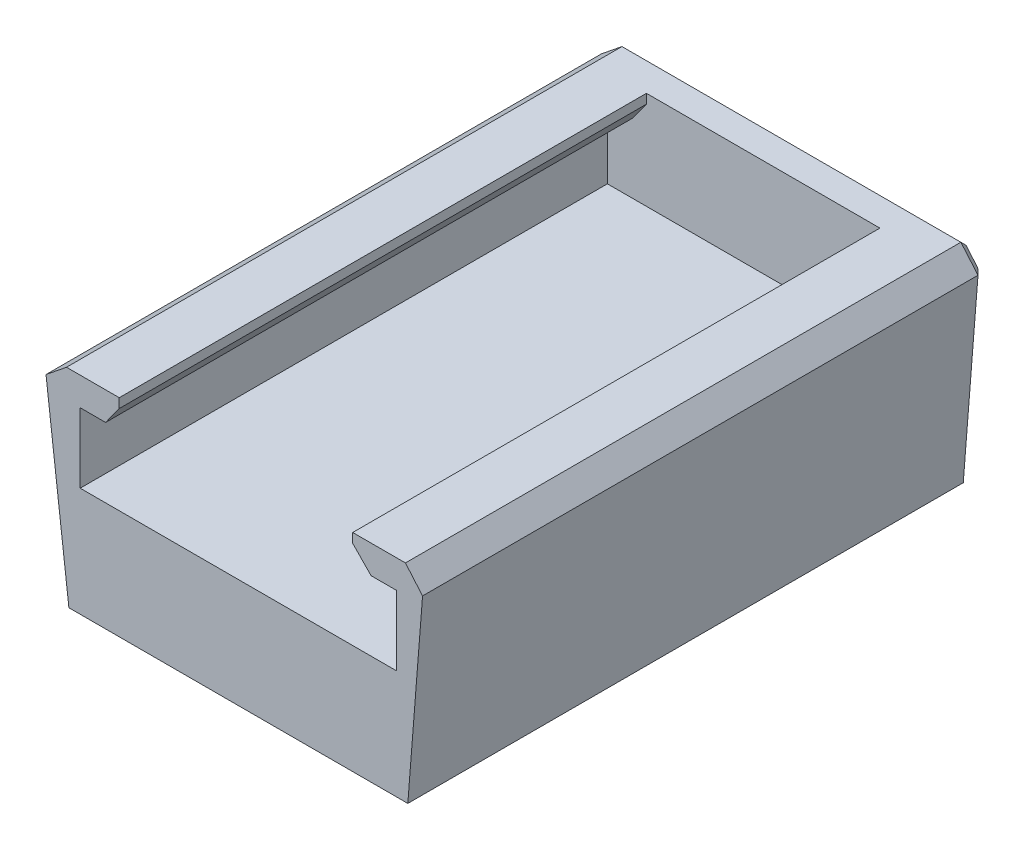
ISO-10303-21;
HEADER;
FILE_DESCRIPTION(('STEP AP214'),'2;1');
FILE_NAME('part.step','',(''),(''),'','','');
FILE_SCHEMA(('AUTOMOTIVE_DESIGN { 1 0 10303 214 1 1 1 1 }'));
ENDSEC;
DATA;
#1=APPLICATION_CONTEXT('core data for automotive mechanical design processes');
#2=APPLICATION_PROTOCOL_DEFINITION('international standard','automotive_design',2000,#1);
#3=PRODUCT_CONTEXT('',#1,'mechanical');
#4=PRODUCT('Part','Part','',(#3));
#5=PRODUCT_RELATED_PRODUCT_CATEGORY('part','',(#4));
#6=PRODUCT_DEFINITION_FORMATION('','',#4);
#7=PRODUCT_DEFINITION_CONTEXT('part definition',#1,'design');
#8=PRODUCT_DEFINITION('design','',#6,#7);
#9=PRODUCT_DEFINITION_SHAPE('','',#8);
#10=(LENGTH_UNIT() NAMED_UNIT(*) SI_UNIT(.MILLI.,.METRE.));
#11=(NAMED_UNIT(*) PLANE_ANGLE_UNIT() SI_UNIT($,.RADIAN.));
#12=(NAMED_UNIT(*) SI_UNIT($,.STERADIAN.) SOLID_ANGLE_UNIT());
#13=UNCERTAINTY_MEASURE_WITH_UNIT(LENGTH_MEASURE(1.E-05),#10,'distance_accuracy_value','');
#14=(GEOMETRIC_REPRESENTATION_CONTEXT(3) GLOBAL_UNCERTAINTY_ASSIGNED_CONTEXT((#13)) GLOBAL_UNIT_ASSIGNED_CONTEXT((#10,
#11,#12)) REPRESENTATION_CONTEXT('',''));
#15=CARTESIAN_POINT('',(0.,0.,0.));
#16=DIRECTION('',(0.,0.,1.));
#17=DIRECTION('',(1.,0.,0.));
#18=AXIS2_PLACEMENT_3D('',#15,#16,#17);
#19=CARTESIAN_POINT('',(-14.4027972027972,9.30053836622378,-30.));
#20=DIRECTION('',(1.,0.,0.));
#21=DIRECTION('',(0.,0.,-1.));
#22=AXIS2_PLACEMENT_3D('',#19,#20,#21);
#23=PLANE('',#22);
#24=DIRECTION('',(0.,0.,1.));
#25=VECTOR('',#24,1.);
#26=CARTESIAN_POINT('',(-14.4027972027972,8.80053836622378,-30.));
#27=LINE('',#26,#25);
#28=CARTESIAN_POINT('',(-14.4027972027972,8.80053836622378,-28.));
#29=VERTEX_POINT('',#28);
#30=CARTESIAN_POINT('',(-14.4027972027972,8.80053836622378,0.));
#31=VERTEX_POINT('',#30);
#32=EDGE_CURVE('E275',#29,#31,#27,.T.);
#33=ORIENTED_EDGE('',*,*,#32,.F.);
#34=DIRECTION('',(0.,1.,0.));
#35=VECTOR('',#34,1.);
#36=CARTESIAN_POINT('',(-14.4027972027972,9.30053836622378,-28.));
#37=LINE('',#36,#35);
#38=CARTESIAN_POINT('',(-14.4027972027972,9.30053836622378,-28.));
#39=VERTEX_POINT('',#38);
#40=EDGE_CURVE('E208',#29,#39,#37,.T.);
#41=ORIENTED_EDGE('',*,*,#40,.T.);
#42=DIRECTION('',(0.,0.,1.));
#43=VECTOR('',#42,1.);
#44=CARTESIAN_POINT('',(-14.4027972027972,9.30053836622378,-30.));
#45=LINE('',#44,#43);
#46=CARTESIAN_POINT('',(-14.4027972027972,9.30053836622378,0.));
#47=VERTEX_POINT('',#46);
#48=EDGE_CURVE('E272',#39,#47,#45,.T.);
#49=ORIENTED_EDGE('',*,*,#48,.T.);
#50=DIRECTION('',(0.,1.,0.));
#51=VECTOR('',#50,1.);
#52=CARTESIAN_POINT('',(-14.4027972027972,9.30053836622378,0.));
#53=LINE('',#52,#51);
#54=EDGE_CURVE('E257',#31,#47,#53,.T.);
#55=ORIENTED_EDGE('',*,*,#54,.F.);
#56=EDGE_LOOP('',(#33,#41,#49,#55));
#57=FACE_BOUND('',#56,.T.);
#58=ADVANCED_FACE('F45',(#57),#23,.T.);
#59=CARTESIAN_POINT('',(-14.4027972027972,8.80053836622378,-30.));
#60=DIRECTION('',(0.810302374787409,-0.586011997670599,0.));
#61=DIRECTION('',(0.586011997670599,0.810302374787409,0.));
#62=AXIS2_PLACEMENT_3D('',#59,#60,#61);
#63=PLANE('',#62);
#64=DIRECTION('',(0.,0.,1.));
#65=VECTOR('',#64,1.);
#66=CARTESIAN_POINT('',(-15.1259988320956,7.80053836622378,-30.));
#67=LINE('',#66,#65);
#68=CARTESIAN_POINT('',(-15.1259988320956,7.80053836622378,-28.));
#69=VERTEX_POINT('',#68);
#70=CARTESIAN_POINT('',(-15.1259988320956,7.80053836622378,0.));
#71=VERTEX_POINT('',#70);
#72=EDGE_CURVE('E278',#69,#71,#67,.T.);
#73=ORIENTED_EDGE('',*,*,#72,.F.);
#74=DIRECTION('',(0.586011997670599,0.810302374787409,0.));
#75=VECTOR('',#74,1.);
#76=CARTESIAN_POINT('',(-14.4027972027972,8.80053836622378,-28.));
#77=LINE('',#76,#75);
#78=EDGE_CURVE('E211',#69,#29,#77,.T.);
#79=ORIENTED_EDGE('',*,*,#78,.T.);
#80=ORIENTED_EDGE('',*,*,#32,.T.);
#81=DIRECTION('',(0.586011997670599,0.810302374787409,0.));
#82=VECTOR('',#81,1.);
#83=CARTESIAN_POINT('',(-14.4027972027972,8.80053836622378,0.));
#84=LINE('',#83,#82);
#85=EDGE_CURVE('E253',#71,#31,#84,.T.);
#86=ORIENTED_EDGE('',*,*,#85,.F.);
#87=EDGE_LOOP('',(#73,#79,#80,#86));
#88=FACE_BOUND('',#87,.T.);
#89=ADVANCED_FACE('F398',(#88),#63,.T.);
#90=CARTESIAN_POINT('',(-16.4759988320956,7.80053836622378,-30.));
#91=DIRECTION('',(0.,-1.,0.));
#92=DIRECTION('',(0.,0.,-1.));
#93=AXIS2_PLACEMENT_3D('',#90,#91,#92);
#94=PLANE('',#93);
#95=DIRECTION('',(0.,0.,1.));
#96=VECTOR('',#95,1.);
#97=CARTESIAN_POINT('',(-16.4759988320956,7.80053836622378,-30.));
#98=LINE('',#97,#96);
#99=CARTESIAN_POINT('',(-16.4759988320956,7.80053836622378,-28.));
#100=VERTEX_POINT('',#99);
#101=CARTESIAN_POINT('',(-16.4759988320956,7.80053836622378,0.));
#102=VERTEX_POINT('',#101);
#103=EDGE_CURVE('E281',#100,#102,#98,.T.);
#104=ORIENTED_EDGE('',*,*,#103,.F.);
#105=DIRECTION('',(1.,0.,0.));
#106=VECTOR('',#105,1.);
#107=CARTESIAN_POINT('',(-16.4759988320956,7.80053836622378,-28.));
#108=LINE('',#107,#106);
#109=EDGE_CURVE('E391',#100,#69,#108,.T.);
#110=ORIENTED_EDGE('',*,*,#109,.T.);
#111=ORIENTED_EDGE('',*,*,#72,.T.);
#112=DIRECTION('',(1.,0.,0.));
#113=VECTOR('',#112,1.);
#114=CARTESIAN_POINT('',(-16.4759988320956,7.80053836622378,0.));
#115=LINE('',#114,#113);
#116=EDGE_CURVE('E249',#102,#71,#115,.T.);
#117=ORIENTED_EDGE('',*,*,#116,.F.);
#118=EDGE_LOOP('',(#104,#110,#111,#117));
#119=FACE_BOUND('',#118,.T.);
#120=ADVANCED_FACE('F437',(#119),#94,.T.);
#121=CARTESIAN_POINT('',(-16.4759988320956,4.10053836622378,-30.));
#122=DIRECTION('',(1.,0.,0.));
#123=DIRECTION('',(0.,0.,-1.));
#124=AXIS2_PLACEMENT_3D('',#121,#122,#123);
#125=PLANE('',#124);
#126=DIRECTION('',(0.,0.,1.));
#127=VECTOR('',#126,1.);
#128=CARTESIAN_POINT('',(-16.4759988320956,4.10053836622378,-30.));
#129=LINE('',#128,#127);
#130=CARTESIAN_POINT('',(-16.4759988320956,4.10053836622378,-28.));
#131=VERTEX_POINT('',#130);
#132=CARTESIAN_POINT('',(-16.4759988320956,4.10053836622378,0.));
#133=VERTEX_POINT('',#132);
#134=EDGE_CURVE('E284',#131,#133,#129,.T.);
#135=ORIENTED_EDGE('',*,*,#134,.F.);
#136=DIRECTION('',(0.,1.,0.));
#137=VECTOR('',#136,1.);
#138=CARTESIAN_POINT('',(-16.4759988320956,4.10053836622378,-28.));
#139=LINE('',#138,#137);
#140=EDGE_CURVE('E379',#131,#100,#139,.T.);
#141=ORIENTED_EDGE('',*,*,#140,.T.);
#142=ORIENTED_EDGE('',*,*,#103,.T.);
#143=DIRECTION('',(0.,1.,0.));
#144=VECTOR('',#143,1.);
#145=CARTESIAN_POINT('',(-16.4759988320956,4.10053836622378,0.));
#146=LINE('',#145,#144);
#147=EDGE_CURVE('E245',#133,#102,#146,.T.);
#148=ORIENTED_EDGE('',*,*,#147,.F.);
#149=EDGE_LOOP('',(#135,#141,#142,#148));
#150=FACE_BOUND('',#149,.T.);
#151=ADVANCED_FACE('F443',(#150),#125,.T.);
#152=CARTESIAN_POINT('',(0.324001167904426,4.10053836622378,-30.));
#153=DIRECTION('',(0.,1.,0.));
#154=DIRECTION('',(0.,0.,1.));
#155=AXIS2_PLACEMENT_3D('',#152,#153,#154);
#156=PLANE('',#155);
#157=DIRECTION('',(0.,0.,1.));
#158=VECTOR('',#157,1.);
#159=CARTESIAN_POINT('',(0.324001167904426,4.10053836622378,-30.));
#160=LINE('',#159,#158);
#161=CARTESIAN_POINT('',(0.324001167904426,4.10053836622378,-28.));
#162=VERTEX_POINT('',#161);
#163=CARTESIAN_POINT('',(0.324001167904426,4.10053836622378,0.));
#164=VERTEX_POINT('',#163);
#165=EDGE_CURVE('E287',#162,#164,#160,.T.);
#166=ORIENTED_EDGE('',*,*,#165,.F.);
#167=DIRECTION('',(-1.,0.,0.));
#168=VECTOR('',#167,1.);
#169=CARTESIAN_POINT('',(0.324001167904426,4.10053836622378,-28.));
#170=LINE('',#169,#168);
#171=EDGE_CURVE('E374',#162,#131,#170,.T.);
#172=ORIENTED_EDGE('',*,*,#171,.T.);
#173=ORIENTED_EDGE('',*,*,#134,.T.);
#174=DIRECTION('',(-1.,0.,0.));
#175=VECTOR('',#174,1.);
#176=CARTESIAN_POINT('',(0.324001167904426,4.10053836622378,0.));
#177=LINE('',#176,#175);
#178=EDGE_CURVE('E241',#164,#133,#177,.T.);
#179=ORIENTED_EDGE('',*,*,#178,.F.);
#180=EDGE_LOOP('',(#166,#172,#173,#179));
#181=FACE_BOUND('',#180,.T.);
#182=ADVANCED_FACE('F447',(#181),#156,.T.);
#183=CARTESIAN_POINT('',(0.324001167904425,7.80053836622378,-30.));
#184=DIRECTION('',(-1.,0.,0.));
#185=DIRECTION('',(0.,-1.,0.));
#186=AXIS2_PLACEMENT_3D('',#183,#184,#185);
#187=PLANE('',#186);
#188=DIRECTION('',(0.,0.,1.));
#189=VECTOR('',#188,1.);
#190=CARTESIAN_POINT('',(0.324001167904425,7.80053836622378,-30.));
#191=LINE('',#190,#189);
#192=CARTESIAN_POINT('',(0.324001167904425,7.80053836622378,-28.));
#193=VERTEX_POINT('',#192);
#194=CARTESIAN_POINT('',(0.324001167904425,7.80053836622378,0.));
#195=VERTEX_POINT('',#194);
#196=EDGE_CURVE('E290',#193,#195,#191,.T.);
#197=ORIENTED_EDGE('',*,*,#196,.F.);
#198=DIRECTION('',(0.,-1.,0.));
#199=VECTOR('',#198,1.);
#200=CARTESIAN_POINT('',(0.324001167904426,4.10053836622378,-28.));
#201=LINE('',#200,#199);
#202=EDGE_CURVE('E369',#193,#162,#201,.T.);
#203=ORIENTED_EDGE('',*,*,#202,.T.);
#204=ORIENTED_EDGE('',*,*,#165,.T.);
#205=DIRECTION('',(0.,-1.,0.));
#206=VECTOR('',#205,1.);
#207=CARTESIAN_POINT('',(0.324001167904425,7.80053836622378,0.));
#208=LINE('',#207,#206);
#209=EDGE_CURVE('E237',#195,#164,#208,.T.);
#210=ORIENTED_EDGE('',*,*,#209,.F.);
#211=EDGE_LOOP('',(#197,#203,#204,#210));
#212=FACE_BOUND('',#211,.T.);
#213=ADVANCED_FACE('F451',(#212),#187,.T.);
#214=CARTESIAN_POINT('',(0.324001167904425,7.80053836622378,-30.));
#215=DIRECTION('',(0.,-1.,0.));
#216=DIRECTION('',(0.,0.,-1.));
#217=AXIS2_PLACEMENT_3D('',#214,#215,#216);
#218=PLANE('',#217);
#219=DIRECTION('',(0.,0.,1.));
#220=VECTOR('',#219,1.);
#221=CARTESIAN_POINT('',(-1.02599883209557,7.80053836622378,-30.));
#222=LINE('',#221,#220);
#223=CARTESIAN_POINT('',(-1.02599883209557,7.80053836622378,-28.));
#224=VERTEX_POINT('',#223);
#225=CARTESIAN_POINT('',(-1.02599883209557,7.80053836622378,0.));
#226=VERTEX_POINT('',#225);
#227=EDGE_CURVE('E293',#224,#226,#222,.T.);
#228=ORIENTED_EDGE('',*,*,#227,.F.);
#229=DIRECTION('',(1.,0.,0.));
#230=VECTOR('',#229,1.);
#231=CARTESIAN_POINT('',(0.324001167904425,7.80053836622378,-28.));
#232=LINE('',#231,#230);
#233=EDGE_CURVE('E388',#224,#193,#232,.T.);
#234=ORIENTED_EDGE('',*,*,#233,.T.);
#235=ORIENTED_EDGE('',*,*,#196,.T.);
#236=DIRECTION('',(1.,0.,0.));
#237=VECTOR('',#236,1.);
#238=CARTESIAN_POINT('',(0.324001167904425,7.80053836622378,0.));
#239=LINE('',#238,#237);
#240=EDGE_CURVE('E233',#226,#195,#239,.T.);
#241=ORIENTED_EDGE('',*,*,#240,.F.);
#242=EDGE_LOOP('',(#228,#234,#235,#241));
#243=FACE_BOUND('',#242,.T.);
#244=ADVANCED_FACE('F453',(#243),#218,.T.);
#245=CARTESIAN_POINT('',(-1.02599883209557,7.80053836622378,-30.));
#246=DIRECTION('',(-0.715356803613816,-0.698759360240294,0.));
#247=DIRECTION('',(0.698759360240294,-0.715356803613816,0.));
#248=AXIS2_PLACEMENT_3D('',#245,#246,#247);
#249=PLANE('',#248);
#250=DIRECTION('',(0.,0.,1.));
#251=VECTOR('',#250,1.);
#252=CARTESIAN_POINT('',(-2.00279720279719,8.80053836622378,-30.));
#253=LINE('',#252,#251);
#254=CARTESIAN_POINT('',(-2.00279720279719,8.80053836622378,-28.));
#255=VERTEX_POINT('',#254);
#256=CARTESIAN_POINT('',(-2.00279720279719,8.80053836622378,0.));
#257=VERTEX_POINT('',#256);
#258=EDGE_CURVE('E296',#255,#257,#253,.T.);
#259=ORIENTED_EDGE('',*,*,#258,.F.);
#260=DIRECTION('',(0.698759360240294,-0.715356803613816,0.));
#261=VECTOR('',#260,1.);
#262=CARTESIAN_POINT('',(-1.02599883209557,7.80053836622378,-28.));
#263=LINE('',#262,#261);
#264=EDGE_CURVE('E385',#255,#224,#263,.T.);
#265=ORIENTED_EDGE('',*,*,#264,.T.);
#266=ORIENTED_EDGE('',*,*,#227,.T.);
#267=DIRECTION('',(0.698759360240294,-0.715356803613816,0.));
#268=VECTOR('',#267,1.);
#269=CARTESIAN_POINT('',(-1.02599883209557,7.80053836622378,0.));
#270=LINE('',#269,#268);
#271=EDGE_CURVE('E229',#257,#226,#270,.T.);
#272=ORIENTED_EDGE('',*,*,#271,.F.);
#273=EDGE_LOOP('',(#259,#265,#266,#272));
#274=FACE_BOUND('',#273,.T.);
#275=ADVANCED_FACE('F415',(#274),#249,.T.);
#276=CARTESIAN_POINT('',(-2.00279720279719,9.30053836622378,-30.));
#277=DIRECTION('',(-1.,0.,0.));
#278=DIRECTION('',(0.,0.,1.));
#279=AXIS2_PLACEMENT_3D('',#276,#277,#278);
#280=PLANE('',#279);
#281=DIRECTION('',(0.,0.,1.));
#282=VECTOR('',#281,1.);
#283=CARTESIAN_POINT('',(-2.00279720279719,9.30053836622378,-30.));
#284=LINE('',#283,#282);
#285=CARTESIAN_POINT('',(-2.00279720279719,9.30053836622378,-28.));
#286=VERTEX_POINT('',#285);
#287=CARTESIAN_POINT('',(-2.00279720279719,9.30053836622378,0.));
#288=VERTEX_POINT('',#287);
#289=EDGE_CURVE('E299',#286,#288,#284,.T.);
#290=ORIENTED_EDGE('',*,*,#289,.F.);
#291=DIRECTION('',(0.,-1.,0.));
#292=VECTOR('',#291,1.);
#293=CARTESIAN_POINT('',(-2.00279720279719,9.30053836622378,-28.));
#294=LINE('',#293,#292);
#295=EDGE_CURVE('E382',#286,#255,#294,.T.);
#296=ORIENTED_EDGE('',*,*,#295,.T.);
#297=ORIENTED_EDGE('',*,*,#258,.T.);
#298=DIRECTION('',(0.,-1.,0.));
#299=VECTOR('',#298,1.);
#300=CARTESIAN_POINT('',(-2.00279720279719,9.30053836622378,0.));
#301=LINE('',#300,#299);
#302=EDGE_CURVE('E225',#288,#257,#301,.T.);
#303=ORIENTED_EDGE('',*,*,#302,.F.);
#304=EDGE_LOOP('',(#290,#296,#297,#303));
#305=FACE_BOUND('',#304,.T.);
#306=ADVANCED_FACE('F411',(#305),#280,.T.);
#307=CARTESIAN_POINT('',(-18.2922060625862,8.42122708106179,-30.));
#308=DIRECTION('',(-0.992856810516027,-0.119312001961003,0.));
#309=DIRECTION('',(0.119312001961003,-0.992856810516027,0.));
#310=AXIS2_PLACEMENT_3D('',#307,#308,#309);
#311=PLANE('',#310);
#312=DIRECTION('',(0.,0.,1.));
#313=VECTOR('',#312,1.);
#314=CARTESIAN_POINT('',(-18.2922060625862,8.42122708106179,-30.));
#315=LINE('',#314,#313);
#316=CARTESIAN_POINT('',(-18.2922060625862,8.42122708106179,-29.5));
#317=VERTEX_POINT('',#316);
#318=CARTESIAN_POINT('',(-18.2922060625862,8.42122708106179,0.));
#319=VERTEX_POINT('',#318);
#320=EDGE_CURVE('E266',#317,#319,#315,.T.);
#321=ORIENTED_EDGE('',*,*,#320,.F.);
#322=DIRECTION('',(0.119312001961003,-0.992856810516027,0.));
#323=VECTOR('',#322,1.);
#324=CARTESIAN_POINT('',(-17.0759988320956,-1.69946163377622,-29.5));
#325=LINE('',#324,#323);
#326=CARTESIAN_POINT('',(-17.0759988320956,-1.69946163377622,-29.5));
#327=VERTEX_POINT('',#326);
#328=EDGE_CURVE('E188',#317,#327,#325,.T.);
#329=ORIENTED_EDGE('',*,*,#328,.T.);
#330=DIRECTION('',(0.,0.,1.));
#331=VECTOR('',#330,1.);
#332=CARTESIAN_POINT('',(-17.0759988320956,-1.69946163377622,-30.));
#333=LINE('',#332,#331);
#334=CARTESIAN_POINT('',(-17.0759988320956,-1.69946163377622,0.));
#335=VERTEX_POINT('',#334);
#336=EDGE_CURVE('E180',#327,#335,#333,.T.);
#337=ORIENTED_EDGE('',*,*,#336,.T.);
#338=DIRECTION('',(0.119312001961003,-0.992856810516027,0.));
#339=VECTOR('',#338,1.);
#340=CARTESIAN_POINT('',(-18.2922060625862,8.42122708106179,0.));
#341=LINE('',#340,#339);
#342=EDGE_CURVE('E185',#319,#335,#341,.T.);
#343=ORIENTED_EDGE('',*,*,#342,.F.);
#344=EDGE_LOOP('',(#321,#329,#337,#343));
#345=FACE_BOUND('',#344,.T.);
#346=ADVANCED_FACE('F183',(#345),#311,.T.);
#347=CARTESIAN_POINT('',(-17.2027972027972,9.30053836622378,-30.));
#348=DIRECTION('',(-0.628079489401421,0.778149185563572,0.));
#349=DIRECTION('',(-0.778149185563572,-0.628079489401421,0.));
#350=AXIS2_PLACEMENT_3D('',#347,#348,#349);
#351=PLANE('',#350);
#352=DIRECTION('',(0.,0.,1.));
#353=VECTOR('',#352,1.);
#354=CARTESIAN_POINT('',(-17.2027972027972,9.30053836622378,-30.));
#355=LINE('',#354,#353);
#356=CARTESIAN_POINT('',(-17.2027972027972,9.30053836622378,-29.5));
#357=VERTEX_POINT('',#356);
#358=CARTESIAN_POINT('',(-17.2027972027972,9.30053836622378,0.));
#359=VERTEX_POINT('',#358);
#360=EDGE_CURVE('E269',#357,#359,#355,.T.);
#361=ORIENTED_EDGE('',*,*,#360,.F.);
#362=DIRECTION('',(-0.778149185563572,-0.628079489401421,0.));
#363=VECTOR('',#362,1.);
#364=CARTESIAN_POINT('',(-18.2922060625862,8.42122708106179,-29.5));
#365=LINE('',#364,#363);
#366=EDGE_CURVE('E11',#357,#317,#365,.T.);
#367=ORIENTED_EDGE('',*,*,#366,.T.);
#368=ORIENTED_EDGE('',*,*,#320,.T.);
#369=DIRECTION('',(-0.778149185563572,-0.628079489401422,0.));
#370=VECTOR('',#369,1.);
#371=CARTESIAN_POINT('',(-17.2027972027972,9.30053836622378,0.));
#372=LINE('',#371,#370);
#373=EDGE_CURVE('E192',#359,#319,#372,.T.);
#374=ORIENTED_EDGE('',*,*,#373,.F.);
#375=EDGE_LOOP('',(#361,#367,#368,#374));
#376=FACE_BOUND('',#375,.T.);
#377=ADVANCED_FACE('F431',(#376),#351,.T.);
#378=CARTESIAN_POINT('',(-17.2027972027972,9.30053836622378,-30.));
#379=DIRECTION('',(0.,1.,0.));
#380=DIRECTION('',(0.,0.,1.));
#381=AXIS2_PLACEMENT_3D('',#378,#379,#380);
#382=PLANE('',#381);
#383=DIRECTION('',(0.,0.,1.));
#384=VECTOR('',#383,1.);
#385=CARTESIAN_POINT('',(0.797202797202808,9.30053836622378,-30.));
#386=LINE('',#385,#384);
#387=CARTESIAN_POINT('',(0.797202797202808,9.30053836622378,-29.5));
#388=VERTEX_POINT('',#387);
#389=CARTESIAN_POINT('',(0.797202797202808,9.30053836622378,0.));
#390=VERTEX_POINT('',#389);
#391=EDGE_CURVE('E302',#388,#390,#386,.T.);
#392=ORIENTED_EDGE('',*,*,#391,.F.);
#393=DIRECTION('',(-1.,0.,0.));
#394=VECTOR('',#393,1.);
#395=CARTESIAN_POINT('',(-17.2027972027972,9.30053836622378,-29.5));
#396=LINE('',#395,#394);
#397=EDGE_CURVE('E56',#388,#357,#396,.T.);
#398=ORIENTED_EDGE('',*,*,#397,.T.);
#399=ORIENTED_EDGE('',*,*,#360,.T.);
#400=DIRECTION('',(-1.,0.,0.));
#401=VECTOR('',#400,1.);
#402=CARTESIAN_POINT('',(-17.2027972027972,9.30053836622378,0.));
#403=LINE('',#402,#401);
#404=EDGE_CURVE('E261',#47,#359,#403,.T.);
#405=ORIENTED_EDGE('',*,*,#404,.F.);
#406=ORIENTED_EDGE('',*,*,#48,.F.);
#407=DIRECTION('',(1.,0.,0.));
#408=VECTOR('',#407,1.);
#409=CARTESIAN_POINT('',(0.324001167904426,9.30053836622378,-28.));
#410=LINE('',#409,#408);
#411=EDGE_CURVE('E363',#39,#286,#410,.T.);
#412=ORIENTED_EDGE('',*,*,#411,.T.);
#413=ORIENTED_EDGE('',*,*,#289,.T.);
#414=DIRECTION('',(-1.,0.,0.));
#415=VECTOR('',#414,1.);
#416=CARTESIAN_POINT('',(0.797202797202808,9.30053836622378,0.));
#417=LINE('',#416,#415);
#418=EDGE_CURVE('E221',#390,#288,#417,.T.);
#419=ORIENTED_EDGE('',*,*,#418,.F.);
#420=EDGE_LOOP('',(#392,#398,#399,#405,#406,#412,#413,#419));
#421=FACE_BOUND('',#420,.T.);
#422=ADVANCED_FACE('F420',(#421),#382,.T.);
#423=CARTESIAN_POINT('',(0.797202797202808,9.30053836622378,-30.));
#424=DIRECTION('',(0.760094758031471,0.649812248894309,0.));
#425=DIRECTION('',(-0.649812248894309,0.760094758031471,0.));
#426=AXIS2_PLACEMENT_3D('',#423,#424,#425);
#427=PLANE('',#426);
#428=DIRECTION('',(0.,0.,1.));
#429=VECTOR('',#428,1.);
#430=CARTESIAN_POINT('',(1.70693994565484,8.23640570497972,-30.));
#431=LINE('',#430,#429);
#432=CARTESIAN_POINT('',(1.70693994565484,8.23640570497972,-29.5));
#433=VERTEX_POINT('',#432);
#434=CARTESIAN_POINT('',(1.70693994565484,8.23640570497972,0.));
#435=VERTEX_POINT('',#434);
#436=EDGE_CURVE('E305',#433,#435,#431,.T.);
#437=ORIENTED_EDGE('',*,*,#436,.F.);
#438=DIRECTION('',(-0.649812248894309,0.760094758031471,0.));
#439=VECTOR('',#438,1.);
#440=CARTESIAN_POINT('',(0.797202797202808,9.30053836622378,-29.5));
#441=LINE('',#440,#439);
#442=EDGE_CURVE('E71',#433,#388,#441,.T.);
#443=ORIENTED_EDGE('',*,*,#442,.T.);
#444=ORIENTED_EDGE('',*,*,#391,.T.);
#445=DIRECTION('',(-0.649812248894309,0.760094758031471,0.));
#446=VECTOR('',#445,1.);
#447=CARTESIAN_POINT('',(0.797202797202808,9.30053836622378,0.));
#448=LINE('',#447,#446);
#449=EDGE_CURVE('E217',#435,#390,#448,.T.);
#450=ORIENTED_EDGE('',*,*,#449,.F.);
#451=EDGE_LOOP('',(#437,#443,#444,#450));
#452=FACE_BOUND('',#451,.T.);
#453=ADVANCED_FACE('F543',(#452),#427,.T.);
#454=CARTESIAN_POINT('',(1.70693994565484,8.23640570497972,-30.));
#455=DIRECTION('',(0.996909723985476,-0.0785557268644469,0.));
#456=DIRECTION('',(0.0785557268644469,0.996909723985476,0.));
#457=AXIS2_PLACEMENT_3D('',#454,#455,#456);
#458=PLANE('',#457);
#459=DIRECTION('',(0.,0.,1.));
#460=VECTOR('',#459,1.);
#461=CARTESIAN_POINT('',(0.924001167904426,-1.69946163377622,-30.));
#462=LINE('',#461,#460);
#463=CARTESIAN_POINT('',(0.924001167904426,-1.69946163377622,-29.5));
#464=VERTEX_POINT('',#463);
#465=CARTESIAN_POINT('',(0.924001167904426,-1.69946163377622,0.));
#466=VERTEX_POINT('',#465);
#467=EDGE_CURVE('E191',#464,#466,#462,.T.);
#468=ORIENTED_EDGE('',*,*,#467,.F.);
#469=DIRECTION('',(0.0785557268644469,0.996909723985476,0.));
#470=VECTOR('',#469,1.);
#471=CARTESIAN_POINT('',(1.70693994565484,8.23640570497972,-29.5));
#472=LINE('',#471,#470);
#473=EDGE_CURVE('E334',#464,#433,#472,.T.);
#474=ORIENTED_EDGE('',*,*,#473,.T.);
#475=ORIENTED_EDGE('',*,*,#436,.T.);
#476=DIRECTION('',(0.0785557268644469,0.996909723985476,0.));
#477=VECTOR('',#476,1.);
#478=CARTESIAN_POINT('',(1.70693994565484,8.23640570497972,0.));
#479=LINE('',#478,#477);
#480=EDGE_CURVE('E202',#466,#435,#479,.T.);
#481=ORIENTED_EDGE('',*,*,#480,.F.);
#482=EDGE_LOOP('',(#468,#474,#475,#481));
#483=FACE_BOUND('',#482,.T.);
#484=ADVANCED_FACE('F552',(#483),#458,.T.);
#485=CARTESIAN_POINT('',(-17.0759988320956,-1.69946163377622,-30.));
#486=DIRECTION('',(0.,-1.,0.));
#487=DIRECTION('',(0.,0.,-1.));
#488=AXIS2_PLACEMENT_3D('',#485,#486,#487);
#489=PLANE('',#488);
#490=ORIENTED_EDGE('',*,*,#336,.F.);
#491=DIRECTION('',(1.,0.,0.));
#492=VECTOR('',#491,1.);
#493=CARTESIAN_POINT('',(0.924001167904426,-1.69946163377622,-29.5));
#494=LINE('',#493,#492);
#495=EDGE_CURVE('E331',#327,#464,#494,.T.);
#496=ORIENTED_EDGE('',*,*,#495,.T.);
#497=ORIENTED_EDGE('',*,*,#467,.T.);
#498=DIRECTION('',(1.,0.,0.));
#499=VECTOR('',#498,1.);
#500=CARTESIAN_POINT('',(-17.0759988320956,-1.69946163377622,0.));
#501=LINE('',#500,#499);
#502=EDGE_CURVE('E195',#335,#466,#501,.T.);
#503=ORIENTED_EDGE('',*,*,#502,.F.);
#504=EDGE_LOOP('',(#490,#496,#497,#503));
#505=FACE_BOUND('',#504,.T.);
#506=ADVANCED_FACE('F196',(#505),#489,.T.);
#507=CARTESIAN_POINT('',(0.,0.,-30.));
#508=DIRECTION('',(0.,0.,1.));
#509=DIRECTION('',(1.,0.,0.));
#510=AXIS2_PLACEMENT_3D('',#507,#508,#509);
#511=PLANE('',#510);
#512=DIRECTION('',(-1.,0.,0.));
#513=VECTOR('',#512,1.);
#514=CARTESIAN_POINT('',(-17.0759988320956,-1.19946163377622,-30.));
#515=LINE('',#514,#513);
#516=CARTESIAN_POINT('',(0.461850859322934,-1.19946163377622,-30.));
#517=VERTEX_POINT('',#516);
#518=CARTESIAN_POINT('',(-16.6324867421794,-1.19946163377622,-30.));
#519=VERTEX_POINT('',#518);
#520=EDGE_CURVE('E324',#517,#519,#515,.T.);
#521=ORIENTED_EDGE('',*,*,#520,.T.);
#522=DIRECTION('',(-0.119312001961003,0.992856810516027,0.));
#523=VECTOR('',#522,1.);
#524=CARTESIAN_POINT('',(-17.7957776573282,8.48088308204229,-30.));
#525=LINE('',#524,#523);
#526=CARTESIAN_POINT('',(-17.7627480154566,8.20602636736049,-30.));
#527=VERTEX_POINT('',#526);
#528=EDGE_CURVE('E327',#519,#527,#525,.T.);
#529=ORIENTED_EDGE('',*,*,#528,.T.);
#530=DIRECTION('',(0.778149185563572,0.628079489401422,0.));
#531=VECTOR('',#530,1.);
#532=CARTESIAN_POINT('',(-16.8887574580965,8.91146377344199,-30.));
#533=LINE('',#532,#531);
#534=CARTESIAN_POINT('',(-17.0261867433091,8.80053836622378,-30.));
#535=VERTEX_POINT('',#534);
#536=EDGE_CURVE('E312',#527,#535,#533,.T.);
#537=ORIENTED_EDGE('',*,*,#536,.T.);
#538=DIRECTION('',(1.,0.,0.));
#539=VECTOR('',#538,1.);
#540=CARTESIAN_POINT('',(0.797202797202808,8.80053836622378,-30.));
#541=LINE('',#540,#539);
#542=CARTESIAN_POINT('',(0.566844840247134,8.80053836622378,-30.));
#543=VERTEX_POINT('',#542);
#544=EDGE_CURVE('E315',#535,#543,#541,.T.);
#545=ORIENTED_EDGE('',*,*,#544,.T.);
#546=DIRECTION('',(0.649812248894309,-0.760094758031471,0.));
#547=VECTOR('',#546,1.);
#548=CARTESIAN_POINT('',(1.3268925666391,7.91149958053257,-30.));
#549=LINE('',#548,#547);
#550=CARTESIAN_POINT('',(1.19220240585845,8.06904860387276,-30.));
#551=VERTEX_POINT('',#550);
#552=EDGE_CURVE('E318',#543,#551,#549,.T.);
#553=ORIENTED_EDGE('',*,*,#552,.T.);
#554=DIRECTION('',(-0.0785557268644469,-0.996909723985476,0.));
#555=VECTOR('',#554,1.);
#556=CARTESIAN_POINT('',(0.425546305911687,-1.660183770344,-30.));
#557=LINE('',#556,#555);
#558=EDGE_CURVE('E321',#551,#517,#557,.T.);
#559=ORIENTED_EDGE('',*,*,#558,.T.);
#560=EDGE_LOOP('',(#521,#529,#537,#545,#553,#559));
#561=FACE_BOUND('',#560,.T.);
#562=ADVANCED_FACE('F572',(#561),#511,.F.);
#563=CARTESIAN_POINT('',(0.,0.,0.));
#564=DIRECTION('',(0.,0.,1.));
#565=DIRECTION('',(1.,0.,0.));
#566=AXIS2_PLACEMENT_3D('',#563,#564,#565);
#567=PLANE('',#566);
#568=ORIENTED_EDGE('',*,*,#342,.T.);
#569=ORIENTED_EDGE('',*,*,#502,.T.);
#570=ORIENTED_EDGE('',*,*,#480,.T.);
#571=ORIENTED_EDGE('',*,*,#449,.T.);
#572=ORIENTED_EDGE('',*,*,#418,.T.);
#573=ORIENTED_EDGE('',*,*,#302,.T.);
#574=ORIENTED_EDGE('',*,*,#271,.T.);
#575=ORIENTED_EDGE('',*,*,#240,.T.);
#576=ORIENTED_EDGE('',*,*,#209,.T.);
#577=ORIENTED_EDGE('',*,*,#178,.T.);
#578=ORIENTED_EDGE('',*,*,#147,.T.);
#579=ORIENTED_EDGE('',*,*,#116,.T.);
#580=ORIENTED_EDGE('',*,*,#85,.T.);
#581=ORIENTED_EDGE('',*,*,#54,.T.);
#582=ORIENTED_EDGE('',*,*,#404,.T.);
#583=ORIENTED_EDGE('',*,*,#373,.T.);
#584=EDGE_LOOP('',(#568,#569,#570,#571,#572,#573,#574,#575,#576,#577,#578,#579,#580,#581,#582,#583));
#585=FACE_BOUND('',#584,.T.);
#586=ADVANCED_FACE('F204',(#585),#567,.T.);
#587=CARTESIAN_POINT('',(0.,0.,-28.));
#588=DIRECTION('',(0.,0.,-1.));
#589=DIRECTION('',(-1.,0.,0.));
#590=AXIS2_PLACEMENT_3D('',#587,#588,#589);
#591=PLANE('',#590);
#592=ORIENTED_EDGE('',*,*,#40,.F.);
#593=ORIENTED_EDGE('',*,*,#78,.F.);
#594=ORIENTED_EDGE('',*,*,#109,.F.);
#595=ORIENTED_EDGE('',*,*,#140,.F.);
#596=ORIENTED_EDGE('',*,*,#171,.F.);
#597=ORIENTED_EDGE('',*,*,#202,.F.);
#598=ORIENTED_EDGE('',*,*,#233,.F.);
#599=ORIENTED_EDGE('',*,*,#264,.F.);
#600=ORIENTED_EDGE('',*,*,#295,.F.);
#601=ORIENTED_EDGE('',*,*,#411,.F.);
#602=EDGE_LOOP('',(#592,#593,#594,#595,#596,#597,#598,#599,#600,#601));
#603=FACE_BOUND('',#602,.T.);
#604=ADVANCED_FACE('F405',(#603),#591,.F.);
#605=CARTESIAN_POINT('',(0.797202797202808,9.30053836622378,-29.5));
#606=DIRECTION('',(0.537468157748399,0.459486647691244,-0.70710678118655));
#607=DIRECTION('',(0.649812248894309,-0.760094758031471,0.));
#608=AXIS2_PLACEMENT_3D('',#605,#606,#607);
#609=PLANE('',#608);
#610=DIRECTION('',(-0.698555105241269,-0.227121879284133,-0.678554652840729));
#611=VECTOR('',#610,1.);
#612=CARTESIAN_POINT('',(1.43183936127968,8.14696199288507,-29.7672241318206));
#613=LINE('',#612,#611);
#614=EDGE_CURVE('E354',#551,#433,#613,.F.);
#615=ORIENTED_EDGE('',*,*,#614,.F.);
#616=ORIENTED_EDGE('',*,*,#552,.F.);
#617=DIRECTION('',(-0.309752780442667,-0.67232924040534,-0.672329240405335));
#618=VECTOR('',#617,1.);
#619=CARTESIAN_POINT('',(-0.929839332652532,5.55193303763149,-33.2486053285923));
#620=LINE('',#619,#618);
#621=EDGE_CURVE('E50',#388,#543,#620,.T.);
#622=ORIENTED_EDGE('',*,*,#621,.F.);
#623=ORIENTED_EDGE('',*,*,#442,.F.);
#624=EDGE_LOOP('',(#615,#616,#622,#623));
#625=FACE_BOUND('',#624,.T.);
#626=ADVANCED_FACE('F48',(#625),#609,.T.);
#627=CARTESIAN_POINT('',(-17.2027972027972,9.30053836622378,-29.5));
#628=DIRECTION('',(0.,0.707106781186545,-0.70710678118655));
#629=DIRECTION('',(1.,0.,0.));
#630=AXIS2_PLACEMENT_3D('',#627,#628,#629);
#631=PLANE('',#630);
#632=ORIENTED_EDGE('',*,*,#621,.T.);
#633=ORIENTED_EDGE('',*,*,#544,.F.);
#634=DIRECTION('',(0.242320949678456,-0.686032272326506,-0.686032272326501));
#635=VECTOR('',#634,1.);
#636=CARTESIAN_POINT('',(-17.2027972027972,9.30053836622378,-29.5));
#637=LINE('',#636,#635);
#638=EDGE_CURVE('E351',#357,#535,#637,.T.);
#639=ORIENTED_EDGE('',*,*,#638,.F.);
#640=ORIENTED_EDGE('',*,*,#397,.F.);
#641=EDGE_LOOP('',(#632,#633,#639,#640));
#642=FACE_BOUND('',#641,.T.);
#643=ADVANCED_FACE('F424',(#642),#631,.T.);
#644=CARTESIAN_POINT('',(1.70693994565484,8.23640570497972,-29.5));
#645=DIRECTION('',(0.704921626060937,-0.0555472871668884,-0.70710678118655));
#646=DIRECTION('',(-0.0785557268644469,-0.996909723985476,0.));
#647=AXIS2_PLACEMENT_3D('',#644,#645,#646);
#648=PLANE('',#647);
#649=ORIENTED_EDGE('',*,*,#614,.T.);
#650=ORIENTED_EDGE('',*,*,#473,.F.);
#651=DIRECTION('',(-0.547092836014535,0.591899243445022,-0.591899243445017));
#652=VECTOR('',#651,1.);
#653=CARTESIAN_POINT('',(-2.05912765225029,1.52798273309116,-32.7274443668674));
#654=LINE('',#653,#652);
#655=EDGE_CURVE('E347',#517,#464,#654,.F.);
#656=ORIENTED_EDGE('',*,*,#655,.F.);
#657=ORIENTED_EDGE('',*,*,#558,.F.);
#658=EDGE_LOOP('',(#649,#650,#656,#657));
#659=FACE_BOUND('',#658,.T.);
#660=ADVANCED_FACE('F597',(#659),#648,.T.);
#661=CARTESIAN_POINT('',(-17.2027972027972,9.30053836622378,-29.5));
#662=DIRECTION('',(-0.444119266079927,0.550234565886787,-0.707106781186551));
#663=DIRECTION('',(0.778149185563572,0.628079489401421,0.));
#664=AXIS2_PLACEMENT_3D('',#661,#662,#663);
#665=PLANE('',#664);
#666=ORIENTED_EDGE('',*,*,#638,.T.);
#667=ORIENTED_EDGE('',*,*,#536,.F.);
#668=DIRECTION('',(-0.697236696200898,0.283395134807427,0.658443761484864));
#669=VECTOR('',#668,1.);
#670=CARTESIAN_POINT('',(-17.936348100871,8.27658693865092,-29.8360586959103));
#671=LINE('',#670,#669);
#672=EDGE_CURVE('E344',#317,#527,#671,.F.);
#673=ORIENTED_EDGE('',*,*,#672,.F.);
#674=ORIENTED_EDGE('',*,*,#366,.F.);
#675=EDGE_LOOP('',(#666,#667,#673,#674));
#676=FACE_BOUND('',#675,.T.);
#677=ADVANCED_FACE('F429',(#676),#665,.T.);
#678=CARTESIAN_POINT('',(-17.0759988320956,-1.69946163377622,-29.5));
#679=DIRECTION('',(0.,-0.707106781186545,-0.70710678118655));
#680=DIRECTION('',(-1.,0.,0.));
#681=AXIS2_PLACEMENT_3D('',#678,#679,#680);
#682=PLANE('',#681);
#683=ORIENTED_EDGE('',*,*,#655,.T.);
#684=ORIENTED_EDGE('',*,*,#495,.F.);
#685=DIRECTION('',(0.53135115728116,0.599026688744324,-0.599026688744319));
#686=VECTOR('',#685,1.);
#687=CARTESIAN_POINT('',(-17.0759988320956,-1.69946163377622,-29.5));
#688=LINE('',#687,#686);
#689=EDGE_CURVE('E341',#519,#327,#688,.F.);
#690=ORIENTED_EDGE('',*,*,#689,.F.);
#691=ORIENTED_EDGE('',*,*,#520,.F.);
#692=EDGE_LOOP('',(#683,#684,#690,#691));
#693=FACE_BOUND('',#692,.T.);
#694=ADVANCED_FACE('F615',(#693),#682,.T.);
#695=CARTESIAN_POINT('',(-18.2922060625862,8.42122708106179,-29.5));
#696=DIRECTION('',(-0.702055783463125,-0.0843663256635671,-0.707106781186552));
#697=DIRECTION('',(-0.119312001961003,0.992856810516027,0.));
#698=AXIS2_PLACEMENT_3D('',#695,#696,#697);
#699=PLANE('',#698);
#700=ORIENTED_EDGE('',*,*,#672,.T.);
#701=ORIENTED_EDGE('',*,*,#528,.F.);
#702=ORIENTED_EDGE('',*,*,#689,.T.);
#703=ORIENTED_EDGE('',*,*,#328,.F.);
#704=EDGE_LOOP('',(#700,#701,#702,#703));
#705=FACE_BOUND('',#704,.T.);
#706=ADVANCED_FACE('F625',(#705),#699,.T.);
#707=CLOSED_SHELL('',(#58,#89,#120,#151,#182,#213,#244,#275,#306,#346,#377,#422,#453,#484,#506,
#562,#586,#604,#626,#643,#660,#677,#694,#706));
#708=MANIFOLD_SOLID_BREP('B2',#707);
#709=ADVANCED_BREP_SHAPE_REPRESENTATION('',(#18,#708),#14);
#710=SHAPE_DEFINITION_REPRESENTATION(#9,#709);
ENDSEC;
END-ISO-10303-21;
